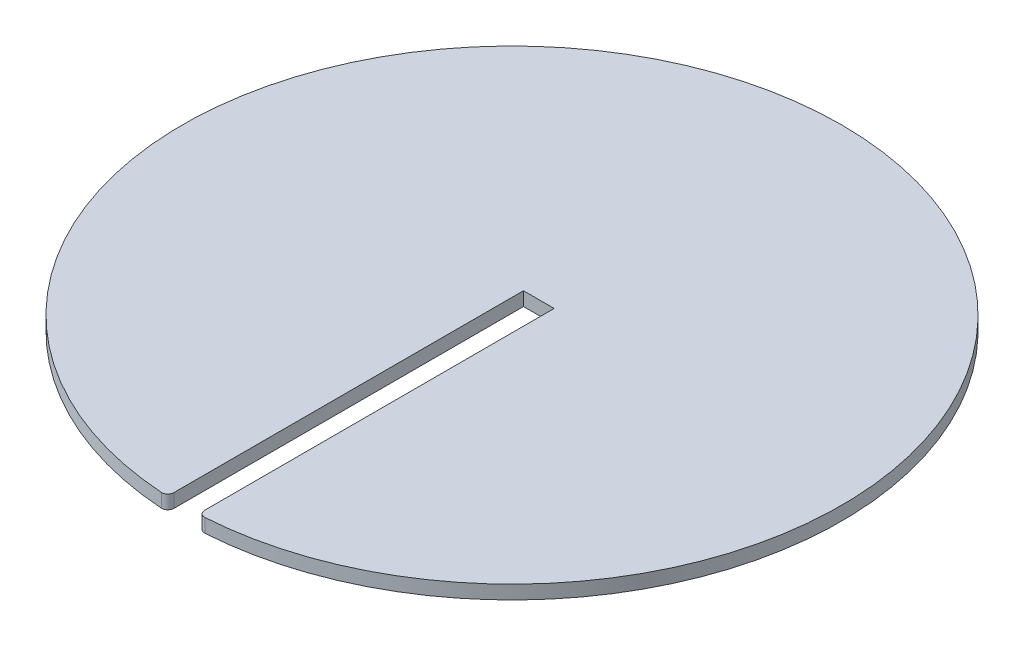
ISO-10303-21;
HEADER;
FILE_DESCRIPTION(('STEP AP214'),'2;1');
FILE_NAME('part.step','',(''),(''),'','','');
FILE_SCHEMA(('AUTOMOTIVE_DESIGN { 1 0 10303 214 1 1 1 1 }'));
ENDSEC;
DATA;
#1=APPLICATION_CONTEXT('core data for automotive mechanical design processes');
#2=APPLICATION_PROTOCOL_DEFINITION('international standard','automotive_design',2000,#1);
#3=PRODUCT_CONTEXT('',#1,'mechanical');
#4=PRODUCT('Part','Part','',(#3));
#5=PRODUCT_RELATED_PRODUCT_CATEGORY('part','',(#4));
#6=PRODUCT_DEFINITION_FORMATION('','',#4);
#7=PRODUCT_DEFINITION_CONTEXT('part definition',#1,'design');
#8=PRODUCT_DEFINITION('design','',#6,#7);
#9=PRODUCT_DEFINITION_SHAPE('','',#8);
#10=(LENGTH_UNIT() NAMED_UNIT(*) SI_UNIT(.MILLI.,.METRE.));
#11=(NAMED_UNIT(*) PLANE_ANGLE_UNIT() SI_UNIT($,.RADIAN.));
#12=(NAMED_UNIT(*) SI_UNIT($,.STERADIAN.) SOLID_ANGLE_UNIT());
#13=UNCERTAINTY_MEASURE_WITH_UNIT(LENGTH_MEASURE(1.E-05),#10,'distance_accuracy_value','');
#14=(GEOMETRIC_REPRESENTATION_CONTEXT(3) GLOBAL_UNCERTAINTY_ASSIGNED_CONTEXT((#13)) GLOBAL_UNIT_ASSIGNED_CONTEXT((#10,
#11,#12)) REPRESENTATION_CONTEXT('',''));
#15=CARTESIAN_POINT('',(0.,0.,0.));
#16=DIRECTION('',(0.,0.,1.));
#17=DIRECTION('',(1.,0.,0.));
#18=AXIS2_PLACEMENT_3D('',#15,#16,#17);
#19=CARTESIAN_POINT('',(5.95849517111807,1.5875,-8.14858922292322));
#20=DIRECTION('',(0.,0.,-1.));
#21=DIRECTION('',(-1.,0.,0.));
#22=AXIS2_PLACEMENT_3D('',#19,#20,#21);
#23=PLANE('',#22);
#24=DIRECTION('',(1.,0.,0.));
#25=VECTOR('',#24,1.);
#26=CARTESIAN_POINT('',(5.95849517111807,0.,-8.14858922292322));
#27=LINE('',#26,#25);
#28=CARTESIAN_POINT('',(2.40849517111807,0.,-8.14858922292322));
#29=VERTEX_POINT('',#28);
#30=CARTESIAN_POINT('',(5.95849517111807,0.,-8.14858922292322));
#31=VERTEX_POINT('',#30);
#32=EDGE_CURVE('E140',#29,#31,#27,.T.);
#33=ORIENTED_EDGE('',*,*,#32,.T.);
#34=DIRECTION('',(0.,-1.,0.));
#35=VECTOR('',#34,1.);
#36=CARTESIAN_POINT('',(5.95849517111807,1.5875,-8.14858922292322));
#37=LINE('',#36,#35);
#38=CARTESIAN_POINT('',(5.95849517111807,1.5875,-8.14858922292322));
#39=VERTEX_POINT('',#38);
#40=EDGE_CURVE('E103',#39,#31,#37,.T.);
#41=ORIENTED_EDGE('',*,*,#40,.F.);
#42=DIRECTION('',(1.,0.,0.));
#43=VECTOR('',#42,1.);
#44=CARTESIAN_POINT('',(5.95849517111807,1.5875,-8.14858922292322));
#45=LINE('',#44,#43);
#46=CARTESIAN_POINT('',(2.40849517111807,1.5875,-8.14858922292322));
#47=VERTEX_POINT('',#46);
#48=EDGE_CURVE('E91',#47,#39,#45,.T.);
#49=ORIENTED_EDGE('',*,*,#48,.F.);
#50=DIRECTION('',(0.,-1.,0.));
#51=VECTOR('',#50,1.);
#52=CARTESIAN_POINT('',(2.40849517111807,1.5875,-8.14858922292322));
#53=LINE('',#52,#51);
#54=EDGE_CURVE('E101',#47,#29,#53,.T.);
#55=ORIENTED_EDGE('',*,*,#54,.T.);
#56=EDGE_LOOP('',(#33,#41,#49,#55));
#57=FACE_BOUND('',#56,.T.);
#58=ADVANCED_FACE('F35',(#57),#23,.F.);
#59=CARTESIAN_POINT('',(5.95849517111807,1.5875,-1.94858922292322));
#60=DIRECTION('',(1.,0.,0.));
#61=DIRECTION('',(0.,0.,-1.));
#62=AXIS2_PLACEMENT_3D('',#59,#60,#61);
#63=PLANE('',#62);
#64=DIRECTION('',(0.,0.,1.));
#65=VECTOR('',#64,1.);
#66=CARTESIAN_POINT('',(5.95849517111807,0.,-1.94858922292322));
#67=LINE('',#66,#65);
#68=CARTESIAN_POINT('',(5.95849517111808,0.,32.2694275384214));
#69=VERTEX_POINT('',#68);
#70=EDGE_CURVE('E137',#31,#69,#67,.T.);
#71=ORIENTED_EDGE('',*,*,#70,.T.);
#72=DIRECTION('',(0.,-1.,0.));
#73=VECTOR('',#72,1.);
#74=CARTESIAN_POINT('',(5.95849517111808,1.5875,32.2694275384214));
#75=LINE('',#74,#73);
#76=CARTESIAN_POINT('',(5.95849517111807,1.5875,32.2694275384214));
#77=VERTEX_POINT('',#76);
#78=EDGE_CURVE('E58',#69,#77,#75,.F.);
#79=ORIENTED_EDGE('',*,*,#78,.T.);
#80=DIRECTION('',(0.,0.,1.));
#81=VECTOR('',#80,1.);
#82=CARTESIAN_POINT('',(5.95849517111807,1.5875,-8.14858922292322));
#83=LINE('',#82,#81);
#84=EDGE_CURVE('E104',#39,#77,#83,.T.);
#85=ORIENTED_EDGE('',*,*,#84,.F.);
#86=ORIENTED_EDGE('',*,*,#40,.T.);
#87=EDGE_LOOP('',(#71,#79,#85,#86));
#88=FACE_BOUND('',#87,.T.);
#89=ADVANCED_FACE('F139',(#88),#63,.F.);
#90=CARTESIAN_POINT('',(4.18349517111807,1.5875,-5.04858922292322));
#91=DIRECTION('',(0.,-1.,0.));
#92=DIRECTION('',(0.,0.,-1.));
#93=AXIS2_PLACEMENT_3D('',#90,#91,#92);
#94=CYLINDRICAL_SURFACE('',#93,38.1);
#95=CARTESIAN_POINT('',(4.18349517111807,1.5875,-5.04858922292322));
#96=DIRECTION('',(0.,1.,0.));
#97=DIRECTION('',(0.,0.,1.));
#98=AXIS2_PLACEMENT_3D('',#95,#96,#97);
#99=CIRCLE('',#98,38.1);
#100=CARTESIAN_POINT('',(6.70481870052984,1.5875,32.9678930927781));
#101=VERTEX_POINT('',#100);
#102=CARTESIAN_POINT('',(1.66217164170631,1.5875,32.9678930927781));
#103=VERTEX_POINT('',#102);
#104=EDGE_CURVE('E113',#101,#103,#99,.T.);
#105=ORIENTED_EDGE('',*,*,#104,.F.);
#106=DIRECTION('',(0.,-1.,0.));
#107=VECTOR('',#106,1.);
#108=CARTESIAN_POINT('',(6.70481870052984,1.5875,32.9678930927781));
#109=LINE('',#108,#107);
#110=CARTESIAN_POINT('',(6.70481870052984,0.,32.9678930927781));
#111=VERTEX_POINT('',#110);
#112=EDGE_CURVE('E111',#101,#111,#109,.T.);
#113=ORIENTED_EDGE('',*,*,#112,.T.);
#114=CARTESIAN_POINT('',(4.18349517111807,0.,-5.04858922292322));
#115=DIRECTION('',(0.,1.,0.));
#116=DIRECTION('',(0.,0.,1.));
#117=AXIS2_PLACEMENT_3D('',#114,#115,#116);
#118=CIRCLE('',#117,38.1);
#119=CARTESIAN_POINT('',(1.66217164170631,0.,32.9678930927781));
#120=VERTEX_POINT('',#119);
#121=EDGE_CURVE('E138',#111,#120,#118,.T.);
#122=ORIENTED_EDGE('',*,*,#121,.T.);
#123=DIRECTION('',(0.,-1.,0.));
#124=VECTOR('',#123,1.);
#125=CARTESIAN_POINT('',(1.66217164170631,1.5875,32.9678930927781));
#126=LINE('',#125,#124);
#127=EDGE_CURVE('E109',#120,#103,#126,.F.);
#128=ORIENTED_EDGE('',*,*,#127,.T.);
#129=EDGE_LOOP('',(#105,#113,#122,#128));
#130=FACE_BOUND('',#129,.T.);
#131=ADVANCED_FACE('F129',(#130),#94,.T.);
#132=CARTESIAN_POINT('',(2.40849517111807,1.5875,-1.94858922292322));
#133=DIRECTION('',(-1.,0.,0.));
#134=DIRECTION('',(0.,0.,1.));
#135=AXIS2_PLACEMENT_3D('',#132,#133,#134);
#136=PLANE('',#135);
#137=DIRECTION('',(0.,0.,-1.));
#138=VECTOR('',#137,1.);
#139=CARTESIAN_POINT('',(2.40849517111807,1.5875,-8.14858922292322));
#140=LINE('',#139,#138);
#141=CARTESIAN_POINT('',(2.40849517111808,1.5875,32.2694275384214));
#142=VERTEX_POINT('',#141);
#143=EDGE_CURVE('E88',#142,#47,#140,.T.);
#144=ORIENTED_EDGE('',*,*,#143,.F.);
#145=DIRECTION('',(0.,-1.,0.));
#146=VECTOR('',#145,1.);
#147=CARTESIAN_POINT('',(2.40849517111808,1.5875,32.2694275384214));
#148=LINE('',#147,#146);
#149=CARTESIAN_POINT('',(2.40849517111808,0.,32.2694275384214));
#150=VERTEX_POINT('',#149);
#151=EDGE_CURVE('E11',#142,#150,#148,.T.);
#152=ORIENTED_EDGE('',*,*,#151,.T.);
#153=DIRECTION('',(0.,0.,-1.));
#154=VECTOR('',#153,1.);
#155=CARTESIAN_POINT('',(2.40849517111807,0.,-1.94858922292322));
#156=LINE('',#155,#154);
#157=EDGE_CURVE('E96',#150,#29,#156,.T.);
#158=ORIENTED_EDGE('',*,*,#157,.T.);
#159=ORIENTED_EDGE('',*,*,#54,.F.);
#160=EDGE_LOOP('',(#144,#152,#158,#159));
#161=FACE_BOUND('',#160,.T.);
#162=ADVANCED_FACE('F106',(#161),#136,.F.);
#163=CARTESIAN_POINT('',(4.18349517111807,1.5875,-5.04858922292322));
#164=DIRECTION('',(0.,1.,0.));
#165=DIRECTION('',(0.,0.,1.));
#166=AXIS2_PLACEMENT_3D('',#163,#164,#165);
#167=PLANE('',#166);
#168=ORIENTED_EDGE('',*,*,#84,.T.);
#169=CARTESIAN_POINT('',(6.65849517111807,1.5875,32.2694275384214));
#170=DIRECTION('',(0.,1.,0.));
#171=DIRECTION('',(0.,0.,1.));
#172=AXIS2_PLACEMENT_3D('',#169,#170,#171);
#173=CIRCLE('',#172,0.7);
#174=EDGE_CURVE('E43',#77,#101,#173,.T.);
#175=ORIENTED_EDGE('',*,*,#174,.T.);
#176=ORIENTED_EDGE('',*,*,#104,.T.);
#177=CARTESIAN_POINT('',(1.70849517111808,1.5875,32.2694275384214));
#178=DIRECTION('',(0.,1.,0.));
#179=DIRECTION('',(0.,0.,1.));
#180=AXIS2_PLACEMENT_3D('',#177,#178,#179);
#181=CIRCLE('',#180,0.7);
#182=EDGE_CURVE('E50',#103,#142,#181,.T.);
#183=ORIENTED_EDGE('',*,*,#182,.T.);
#184=ORIENTED_EDGE('',*,*,#143,.T.);
#185=ORIENTED_EDGE('',*,*,#48,.T.);
#186=EDGE_LOOP('',(#168,#175,#176,#183,#184,#185));
#187=FACE_BOUND('',#186,.T.);
#188=ADVANCED_FACE('F90',(#187),#167,.T.);
#189=CARTESIAN_POINT('',(4.18349517111807,0.,-5.04858922292322));
#190=DIRECTION('',(0.,1.,0.));
#191=DIRECTION('',(0.,0.,1.));
#192=AXIS2_PLACEMENT_3D('',#189,#190,#191);
#193=PLANE('',#192);
#194=ORIENTED_EDGE('',*,*,#121,.F.);
#195=CARTESIAN_POINT('',(6.65849517111807,0.,32.2694275384214));
#196=DIRECTION('',(0.,1.,0.));
#197=DIRECTION('',(0.,0.,1.));
#198=AXIS2_PLACEMENT_3D('',#195,#196,#197);
#199=CIRCLE('',#198,0.7);
#200=EDGE_CURVE('E121',#111,#69,#199,.F.);
#201=ORIENTED_EDGE('',*,*,#200,.T.);
#202=ORIENTED_EDGE('',*,*,#70,.F.);
#203=ORIENTED_EDGE('',*,*,#32,.F.);
#204=ORIENTED_EDGE('',*,*,#157,.F.);
#205=CARTESIAN_POINT('',(1.70849517111808,0.,32.2694275384214));
#206=DIRECTION('',(0.,1.,0.));
#207=DIRECTION('',(0.,0.,1.));
#208=AXIS2_PLACEMENT_3D('',#205,#206,#207);
#209=CIRCLE('',#208,0.7);
#210=EDGE_CURVE('E119',#150,#120,#209,.F.);
#211=ORIENTED_EDGE('',*,*,#210,.T.);
#212=EDGE_LOOP('',(#194,#201,#202,#203,#204,#211));
#213=FACE_BOUND('',#212,.T.);
#214=ADVANCED_FACE('F136',(#213),#193,.F.);
#215=CARTESIAN_POINT('',(6.65849517111807,1.5875,32.2694275384214));
#216=DIRECTION('',(0.,-1.,0.));
#217=DIRECTION('',(0.,0.,-1.));
#218=AXIS2_PLACEMENT_3D('',#215,#216,#217);
#219=CYLINDRICAL_SURFACE('',#218,0.7);
#220=ORIENTED_EDGE('',*,*,#174,.F.);
#221=ORIENTED_EDGE('',*,*,#78,.F.);
#222=ORIENTED_EDGE('',*,*,#200,.F.);
#223=ORIENTED_EDGE('',*,*,#112,.F.);
#224=EDGE_LOOP('',(#220,#221,#222,#223));
#225=FACE_BOUND('',#224,.T.);
#226=ADVANCED_FACE('F134',(#225),#219,.T.);
#227=CARTESIAN_POINT('',(1.70849517111808,1.5875,32.2694275384214));
#228=DIRECTION('',(0.,-1.,0.));
#229=DIRECTION('',(0.,0.,-1.));
#230=AXIS2_PLACEMENT_3D('',#227,#228,#229);
#231=CYLINDRICAL_SURFACE('',#230,0.7);
#232=ORIENTED_EDGE('',*,*,#182,.F.);
#233=ORIENTED_EDGE('',*,*,#127,.F.);
#234=ORIENTED_EDGE('',*,*,#210,.F.);
#235=ORIENTED_EDGE('',*,*,#151,.F.);
#236=EDGE_LOOP('',(#232,#233,#234,#235));
#237=FACE_BOUND('',#236,.T.);
#238=ADVANCED_FACE('F37',(#237),#231,.T.);
#239=CLOSED_SHELL('',(#58,#89,#131,#162,#188,#214,#226,#238));
#240=MANIFOLD_SOLID_BREP('B2',#239);
#241=ADVANCED_BREP_SHAPE_REPRESENTATION('',(#18,#240),#14);
#242=SHAPE_DEFINITION_REPRESENTATION(#9,#241);
ENDSEC;
END-ISO-10303-21;
